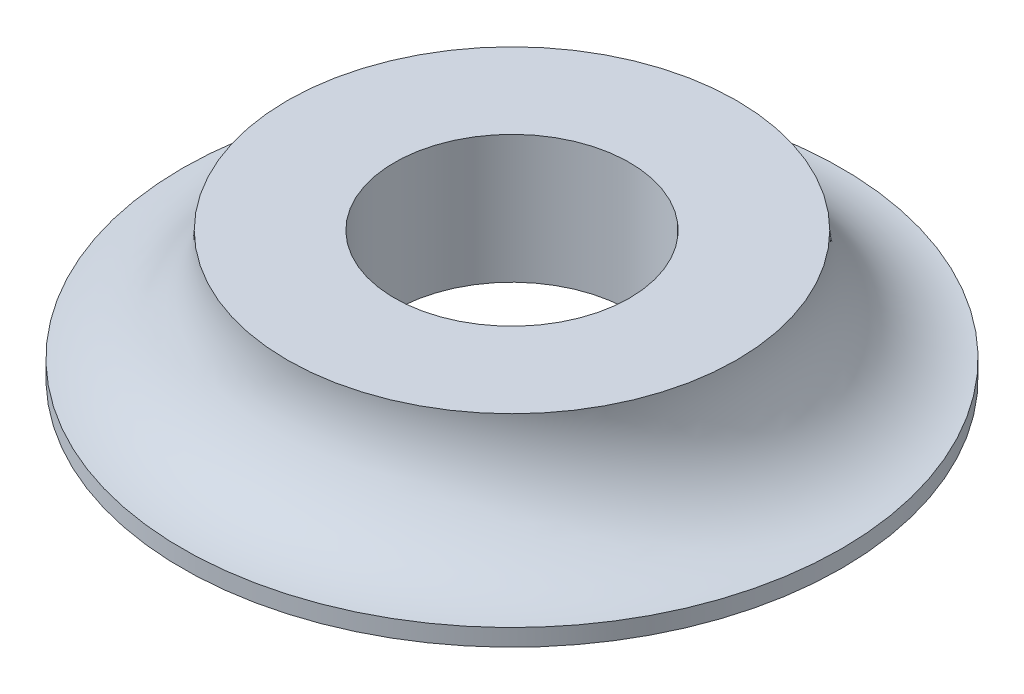
ISO-10303-21;
HEADER;
FILE_DESCRIPTION(('STEP AP214'),'2;1');
FILE_NAME('part.step','',(''),(''),'','','');
FILE_SCHEMA(('AUTOMOTIVE_DESIGN { 1 0 10303 214 1 1 1 1 }'));
ENDSEC;
DATA;
#1=APPLICATION_CONTEXT('core data for automotive mechanical design processes');
#2=APPLICATION_PROTOCOL_DEFINITION('international standard','automotive_design',2000,#1);
#3=PRODUCT_CONTEXT('',#1,'mechanical');
#4=PRODUCT('Part','Part','',(#3));
#5=PRODUCT_RELATED_PRODUCT_CATEGORY('part','',(#4));
#6=PRODUCT_DEFINITION_FORMATION('','',#4);
#7=PRODUCT_DEFINITION_CONTEXT('part definition',#1,'design');
#8=PRODUCT_DEFINITION('design','',#6,#7);
#9=PRODUCT_DEFINITION_SHAPE('','',#8);
#10=(LENGTH_UNIT() NAMED_UNIT(*) SI_UNIT(.MILLI.,.METRE.));
#11=(NAMED_UNIT(*) PLANE_ANGLE_UNIT() SI_UNIT($,.RADIAN.));
#12=(NAMED_UNIT(*) SI_UNIT($,.STERADIAN.) SOLID_ANGLE_UNIT());
#13=UNCERTAINTY_MEASURE_WITH_UNIT(LENGTH_MEASURE(1.E-05),#10,'distance_accuracy_value','');
#14=(GEOMETRIC_REPRESENTATION_CONTEXT(3) GLOBAL_UNCERTAINTY_ASSIGNED_CONTEXT((#13)) GLOBAL_UNIT_ASSIGNED_CONTEXT((#10,
#11,#12)) REPRESENTATION_CONTEXT('',''));
#15=CARTESIAN_POINT('',(0.,0.,0.));
#16=DIRECTION('',(0.,0.,1.));
#17=DIRECTION('',(1.,0.,0.));
#18=AXIS2_PLACEMENT_3D('',#15,#16,#17);
#19=CARTESIAN_POINT('',(3.9624,0.,0.));
#20=DIRECTION('',(0.,-1.,0.));
#21=DIRECTION('',(1.,0.,0.));
#22=AXIS2_PLACEMENT_3D('',#19,#20,#21);
#23=PLANE('',#22);
#24=CARTESIAN_POINT('',(0.,0.,0.));
#25=DIRECTION('',(0.,-1.,0.));
#26=DIRECTION('',(1.,0.,0.));
#27=AXIS2_PLACEMENT_3D('',#24,#25,#26);
#28=CIRCLE('',#27,11.1125);
#29=CARTESIAN_POINT('',(11.1125,0.,0.));
#30=VERTEX_POINT('',#29);
#31=EDGE_CURVE('E50',#30,#30,#28,.T.);
#32=ORIENTED_EDGE('',*,*,#31,.T.);
#33=EDGE_LOOP('',(#32));
#34=FACE_BOUND('',#33,.T.);
#35=CARTESIAN_POINT('',(0.,0.,0.));
#36=DIRECTION('',(0.,-1.,0.));
#37=DIRECTION('',(1.,0.,0.));
#38=AXIS2_PLACEMENT_3D('',#35,#36,#37);
#39=CIRCLE('',#38,3.9624);
#40=CARTESIAN_POINT('',(3.9624,0.,0.));
#41=VERTEX_POINT('',#40);
#42=EDGE_CURVE('E10',#41,#41,#39,.T.);
#43=ORIENTED_EDGE('',*,*,#42,.F.);
#44=EDGE_LOOP('',(#43));
#45=FACE_BOUND('',#44,.T.);
#46=ADVANCED_FACE('F31',(#34,#45),#23,.T.);
#47=CARTESIAN_POINT('',(0.,0.,0.));
#48=DIRECTION('',(0.,-1.,0.));
#49=DIRECTION('',(1.,0.,0.));
#50=AXIS2_PLACEMENT_3D('',#47,#48,#49);
#51=CYLINDRICAL_SURFACE('',#50,3.9624);
#52=ORIENTED_EDGE('',*,*,#42,.T.);
#53=EDGE_LOOP('',(#52));
#54=FACE_BOUND('',#53,.T.);
#55=CARTESIAN_POINT('',(0.,4.318,0.));
#56=DIRECTION('',(0.,-1.,0.));
#57=DIRECTION('',(1.,0.,0.));
#58=AXIS2_PLACEMENT_3D('',#55,#56,#57);
#59=CIRCLE('',#58,3.96239999999999);
#60=CARTESIAN_POINT('',(3.9624,4.318,0.));
#61=VERTEX_POINT('',#60);
#62=EDGE_CURVE('E37',#61,#61,#59,.T.);
#63=ORIENTED_EDGE('',*,*,#62,.F.);
#64=EDGE_LOOP('',(#63));
#65=FACE_BOUND('',#64,.T.);
#66=ADVANCED_FACE('F68',(#54,#65),#51,.F.);
#67=CARTESIAN_POINT('',(3.9624,4.318,0.));
#68=DIRECTION('',(0.,1.,0.));
#69=DIRECTION('',(-1.,0.,0.));
#70=AXIS2_PLACEMENT_3D('',#67,#68,#69);
#71=PLANE('',#70);
#72=ORIENTED_EDGE('',*,*,#62,.T.);
#73=EDGE_LOOP('',(#72));
#74=FACE_BOUND('',#73,.T.);
#75=CARTESIAN_POINT('',(0.,4.31800000000001,0.));
#76=DIRECTION('',(0.,-1.,0.));
#77=DIRECTION('',(1.,0.,0.));
#78=AXIS2_PLACEMENT_3D('',#75,#76,#77);
#79=CIRCLE('',#78,7.57676975505465);
#80=CARTESIAN_POINT('',(7.57676975505465,4.318,0.));
#81=VERTEX_POINT('',#80);
#82=EDGE_CURVE('E41',#81,#81,#79,.T.);
#83=ORIENTED_EDGE('',*,*,#82,.F.);
#84=EDGE_LOOP('',(#83));
#85=FACE_BOUND('',#84,.T.);
#86=ADVANCED_FACE('F64',(#74,#85),#71,.T.);
#87=CARTESIAN_POINT('',(0.,4.2142929161544,0.));
#88=DIRECTION('',(0.,-1.,0.));
#89=DIRECTION('',(1.,0.,0.));
#90=AXIS2_PLACEMENT_3D('',#87,#88,#89);
#91=TOROIDAL_SURFACE('',#90,11.2162070838456,3.64091461441173);
#92=ORIENTED_EDGE('',*,*,#82,.T.);
#93=EDGE_LOOP('',(#92));
#94=FACE_BOUND('',#93,.T.);
#95=CARTESIAN_POINT('',(0.,0.574855587363429,0.));
#96=DIRECTION('',(0.,-1.,0.));
#97=DIRECTION('',(1.,0.,0.));
#98=AXIS2_PLACEMENT_3D('',#95,#96,#97);
#99=CIRCLE('',#98,11.1125);
#100=CARTESIAN_POINT('',(11.1125,0.574855587363417,0.));
#101=VERTEX_POINT('',#100);
#102=EDGE_CURVE('E45',#101,#101,#99,.T.);
#103=ORIENTED_EDGE('',*,*,#102,.F.);
#104=EDGE_LOOP('',(#103));
#105=FACE_BOUND('',#104,.T.);
#106=ADVANCED_FACE('F58',(#94,#105),#91,.F.);
#107=CARTESIAN_POINT('',(0.,0.,0.));
#108=DIRECTION('',(0.,-1.,0.));
#109=DIRECTION('',(1.,0.,0.));
#110=AXIS2_PLACEMENT_3D('',#107,#108,#109);
#111=CYLINDRICAL_SURFACE('',#110,11.1125);
#112=ORIENTED_EDGE('',*,*,#102,.T.);
#113=EDGE_LOOP('',(#112));
#114=FACE_BOUND('',#113,.T.);
#115=ORIENTED_EDGE('',*,*,#31,.F.);
#116=EDGE_LOOP('',(#115));
#117=FACE_BOUND('',#116,.T.);
#118=ADVANCED_FACE('F56',(#114,#117),#111,.T.);
#119=CLOSED_SHELL('',(#46,#66,#86,#106,#118));
#120=MANIFOLD_SOLID_BREP('B2',#119);
#121=ADVANCED_BREP_SHAPE_REPRESENTATION('',(#18,#120),#14);
#122=SHAPE_DEFINITION_REPRESENTATION(#9,#121);
ENDSEC;
END-ISO-10303-21;
